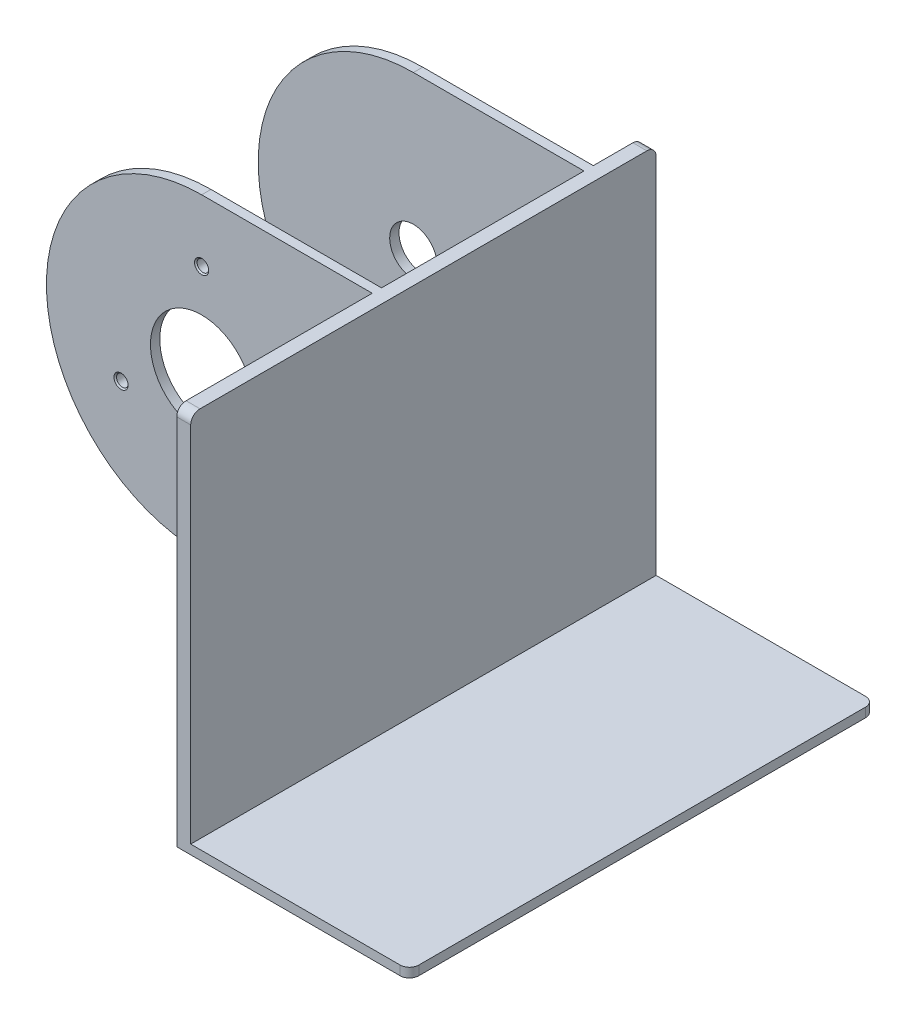
ISO-10303-21;
HEADER;
FILE_DESCRIPTION(('STEP AP214'),'2;1');
FILE_NAME('part.step','',(''),(''),'','','');
FILE_SCHEMA(('AUTOMOTIVE_DESIGN { 1 0 10303 214 1 1 1 1 }'));
ENDSEC;
DATA;
#1=APPLICATION_CONTEXT('core data for automotive mechanical design processes');
#2=APPLICATION_PROTOCOL_DEFINITION('international standard','automotive_design',2000,#1);
#3=PRODUCT_CONTEXT('',#1,'mechanical');
#4=PRODUCT('Part','Part','',(#3));
#5=PRODUCT_RELATED_PRODUCT_CATEGORY('part','',(#4));
#6=PRODUCT_DEFINITION_FORMATION('','',#4);
#7=PRODUCT_DEFINITION_CONTEXT('part definition',#1,'design');
#8=PRODUCT_DEFINITION('design','',#6,#7);
#9=PRODUCT_DEFINITION_SHAPE('','',#8);
#10=(LENGTH_UNIT() NAMED_UNIT(*) SI_UNIT(.MILLI.,.METRE.));
#11=(NAMED_UNIT(*) PLANE_ANGLE_UNIT() SI_UNIT($,.RADIAN.));
#12=(NAMED_UNIT(*) SI_UNIT($,.STERADIAN.) SOLID_ANGLE_UNIT());
#13=UNCERTAINTY_MEASURE_WITH_UNIT(LENGTH_MEASURE(1.E-05),#10,'distance_accuracy_value','');
#14=(GEOMETRIC_REPRESENTATION_CONTEXT(3) GLOBAL_UNCERTAINTY_ASSIGNED_CONTEXT((#13)) GLOBAL_UNIT_ASSIGNED_CONTEXT((#10,
#11,#12)) REPRESENTATION_CONTEXT('',''));
#15=CARTESIAN_POINT('',(0.,0.,0.));
#16=DIRECTION('',(0.,0.,1.));
#17=DIRECTION('',(1.,0.,0.));
#18=AXIS2_PLACEMENT_3D('',#15,#16,#17);
#19=CARTESIAN_POINT('',(0.,82.,0.));
#20=DIRECTION('',(0.,1.,0.));
#21=DIRECTION('',(0.,0.,1.));
#22=AXIS2_PLACEMENT_3D('',#19,#20,#21);
#23=PLANE('',#22);
#24=DIRECTION('',(0.,0.,-1.));
#25=VECTOR('',#24,1.);
#26=CARTESIAN_POINT('',(-22.,82.,-50.));
#27=LINE('',#26,#25);
#28=CARTESIAN_POINT('',(-22.,82.,48.));
#29=VERTEX_POINT('',#28);
#30=CARTESIAN_POINT('',(-22.,82.,-48.));
#31=VERTEX_POINT('',#30);
#32=EDGE_CURVE('E313',#29,#31,#27,.T.);
#33=ORIENTED_EDGE('',*,*,#32,.T.);
#34=DIRECTION('',(-1.,0.,0.));
#35=VECTOR('',#34,1.);
#36=CARTESIAN_POINT('',(-25.,82.,-48.));
#37=LINE('',#36,#35);
#38=CARTESIAN_POINT('',(-25.,82.,-48.));
#39=VERTEX_POINT('',#38);
#40=EDGE_CURVE('E375',#31,#39,#37,.T.);
#41=ORIENTED_EDGE('',*,*,#40,.T.);
#42=DIRECTION('',(0.,0.,1.));
#43=VECTOR('',#42,1.);
#44=CARTESIAN_POINT('',(-25.,82.,-50.));
#45=LINE('',#44,#43);
#46=CARTESIAN_POINT('',(-25.,82.,-39.5));
#47=VERTEX_POINT('',#46);
#48=EDGE_CURVE('E311',#39,#47,#45,.T.);
#49=ORIENTED_EDGE('',*,*,#48,.T.);
#50=DIRECTION('',(1.,0.,0.));
#51=VECTOR('',#50,1.);
#52=CARTESIAN_POINT('',(-95.,82.,-39.5));
#53=LINE('',#52,#51);
#54=CARTESIAN_POINT('',(-61.65,82.,-39.4999999999999));
#55=VERTEX_POINT('',#54);
#56=EDGE_CURVE('E235',#55,#47,#53,.T.);
#57=ORIENTED_EDGE('',*,*,#56,.F.);
#58=DIRECTION('',(0.,0.,-1.));
#59=VECTOR('',#58,1.);
#60=CARTESIAN_POINT('',(-61.65,82.,50.));
#61=LINE('',#60,#59);
#62=CARTESIAN_POINT('',(-61.65,82.,-37.4999999999999));
#63=VERTEX_POINT('',#62);
#64=EDGE_CURVE('E221',#63,#55,#61,.T.);
#65=ORIENTED_EDGE('',*,*,#64,.F.);
#66=DIRECTION('',(1.,0.,0.));
#67=VECTOR('',#66,1.);
#68=CARTESIAN_POINT('',(-95.,82.,-37.5));
#69=LINE('',#68,#67);
#70=CARTESIAN_POINT('',(-25.,82.,-37.5));
#71=VERTEX_POINT('',#70);
#72=EDGE_CURVE('E232',#63,#71,#69,.T.);
#73=ORIENTED_EDGE('',*,*,#72,.T.);
#74=CARTESIAN_POINT('',(-25.,82.,6.));
#75=VERTEX_POINT('',#74);
#76=EDGE_CURVE('E314',#71,#75,#45,.T.);
#77=ORIENTED_EDGE('',*,*,#76,.T.);
#78=DIRECTION('',(1.,0.,0.));
#79=VECTOR('',#78,1.);
#80=CARTESIAN_POINT('',(-95.,82.,6.));
#81=LINE('',#80,#79);
#82=CARTESIAN_POINT('',(-61.65,82.,6.));
#83=VERTEX_POINT('',#82);
#84=EDGE_CURVE('E302',#83,#75,#81,.T.);
#85=ORIENTED_EDGE('',*,*,#84,.F.);
#86=DIRECTION('',(0.,0.,-1.));
#87=VECTOR('',#86,1.);
#88=CARTESIAN_POINT('',(-61.65,82.,8.00000000000001));
#89=LINE('',#88,#87);
#90=CARTESIAN_POINT('',(-61.65,82.,8.));
#91=VERTEX_POINT('',#90);
#92=EDGE_CURVE('E285',#91,#83,#89,.T.);
#93=ORIENTED_EDGE('',*,*,#92,.F.);
#94=DIRECTION('',(1.,0.,0.));
#95=VECTOR('',#94,1.);
#96=CARTESIAN_POINT('',(-95.,82.,8.));
#97=LINE('',#96,#95);
#98=CARTESIAN_POINT('',(-25.,82.,8.));
#99=VERTEX_POINT('',#98);
#100=EDGE_CURVE('E301',#91,#99,#97,.T.);
#101=ORIENTED_EDGE('',*,*,#100,.T.);
#102=CARTESIAN_POINT('',(-25.,82.,48.));
#103=VERTEX_POINT('',#102);
#104=EDGE_CURVE('E315',#99,#103,#45,.T.);
#105=ORIENTED_EDGE('',*,*,#104,.T.);
#106=DIRECTION('',(1.,0.,0.));
#107=VECTOR('',#106,1.);
#108=CARTESIAN_POINT('',(-22.,82.,48.));
#109=LINE('',#108,#107);
#110=EDGE_CURVE('E348',#103,#29,#109,.T.);
#111=ORIENTED_EDGE('',*,*,#110,.T.);
#112=EDGE_LOOP('',(#33,#41,#49,#57,#65,#73,#77,#85,#93,#101,#105,#111));
#113=FACE_BOUND('',#112,.T.);
#114=ADVANCED_FACE('F95',(#113),#23,.T.);
#115=CARTESIAN_POINT('',(-25.,2.,-50.));
#116=DIRECTION('',(0.,0.,1.));
#117=DIRECTION('',(1.,0.,0.));
#118=AXIS2_PLACEMENT_3D('',#115,#116,#117);
#119=PLANE('',#118);
#120=DIRECTION('',(0.,-1.,0.));
#121=VECTOR('',#120,1.);
#122=CARTESIAN_POINT('',(-25.,2.,-50.));
#123=LINE('',#122,#121);
#124=CARTESIAN_POINT('',(-25.,80.,-50.));
#125=VERTEX_POINT('',#124);
#126=CARTESIAN_POINT('',(-25.,0.,-50.));
#127=VERTEX_POINT('',#126);
#128=EDGE_CURVE('E346',#125,#127,#123,.T.);
#129=ORIENTED_EDGE('',*,*,#128,.F.);
#130=DIRECTION('',(-1.,0.,0.));
#131=VECTOR('',#130,1.);
#132=CARTESIAN_POINT('',(-22.,80.,-50.));
#133=LINE('',#132,#131);
#134=CARTESIAN_POINT('',(-22.,80.,-50.));
#135=VERTEX_POINT('',#134);
#136=EDGE_CURVE('E103',#125,#135,#133,.F.);
#137=ORIENTED_EDGE('',*,*,#136,.T.);
#138=DIRECTION('',(0.,-1.,0.));
#139=VECTOR('',#138,1.);
#140=CARTESIAN_POINT('',(-22.,82.,-50.));
#141=LINE('',#140,#139);
#142=CARTESIAN_POINT('',(-22.,2.,-50.));
#143=VERTEX_POINT('',#142);
#144=EDGE_CURVE('E317',#135,#143,#141,.T.);
#145=ORIENTED_EDGE('',*,*,#144,.T.);
#146=DIRECTION('',(-1.,0.,0.));
#147=VECTOR('',#146,1.);
#148=CARTESIAN_POINT('',(-25.,2.,-50.));
#149=LINE('',#148,#147);
#150=CARTESIAN_POINT('',(23.,2.,-50.));
#151=VERTEX_POINT('',#150);
#152=EDGE_CURVE('E327',#151,#143,#149,.T.);
#153=ORIENTED_EDGE('',*,*,#152,.F.);
#154=DIRECTION('',(0.,-1.,0.));
#155=VECTOR('',#154,1.);
#156=CARTESIAN_POINT('',(23.,2.,-50.));
#157=LINE('',#156,#155);
#158=CARTESIAN_POINT('',(23.,0.,-50.));
#159=VERTEX_POINT('',#158);
#160=EDGE_CURVE('E359',#151,#159,#157,.T.);
#161=ORIENTED_EDGE('',*,*,#160,.T.);
#162=DIRECTION('',(-1.,0.,0.));
#163=VECTOR('',#162,1.);
#164=CARTESIAN_POINT('',(-25.,0.,-50.));
#165=LINE('',#164,#163);
#166=EDGE_CURVE('E337',#159,#127,#165,.T.);
#167=ORIENTED_EDGE('',*,*,#166,.T.);
#168=EDGE_LOOP('',(#129,#137,#145,#153,#161,#167));
#169=FACE_BOUND('',#168,.T.);
#170=ADVANCED_FACE('F405',(#169),#119,.F.);
#171=CARTESIAN_POINT('',(-95.,82.,-39.5));
#172=DIRECTION('',(0.,0.,1.));
#173=DIRECTION('',(0.,-1.,0.));
#174=AXIS2_PLACEMENT_3D('',#171,#172,#173);
#175=PLANE('',#174);
#176=CARTESIAN_POINT('',(-61.65,48.65,-39.5));
#177=DIRECTION('',(0.,0.,-1.));
#178=DIRECTION('',(0.,1.,0.));
#179=AXIS2_PLACEMENT_3D('',#176,#177,#178);
#180=CIRCLE('',#179,5.1);
#181=CARTESIAN_POINT('',(-61.65,53.75,-39.5));
#182=VERTEX_POINT('',#181);
#183=EDGE_CURVE('E395',#182,#182,#180,.T.);
#184=ORIENTED_EDGE('',*,*,#183,.F.);
#185=EDGE_LOOP('',(#184));
#186=FACE_BOUND('',#185,.T.);
#187=CARTESIAN_POINT('',(-61.65,48.65,-39.5));
#188=DIRECTION('',(0.,0.,1.));
#189=DIRECTION('',(0.,-1.,0.));
#190=AXIS2_PLACEMENT_3D('',#187,#188,#189);
#191=CIRCLE('',#190,33.35);
#192=CARTESIAN_POINT('',(-61.65,15.3,-39.4999999999999));
#193=VERTEX_POINT('',#192);
#194=EDGE_CURVE('E228',#55,#193,#191,.T.);
#195=ORIENTED_EDGE('',*,*,#194,.F.);
#196=ORIENTED_EDGE('',*,*,#56,.T.);
#197=DIRECTION('',(0.,-1.,0.));
#198=VECTOR('',#197,1.);
#199=CARTESIAN_POINT('',(-25.,82.,-39.5));
#200=LINE('',#199,#198);
#201=CARTESIAN_POINT('',(-25.,15.3,-39.5));
#202=VERTEX_POINT('',#201);
#203=EDGE_CURVE('E386',#47,#202,#200,.T.);
#204=ORIENTED_EDGE('',*,*,#203,.T.);
#205=DIRECTION('',(1.,0.,0.));
#206=VECTOR('',#205,1.);
#207=CARTESIAN_POINT('',(-95.,15.3,-39.5));
#208=LINE('',#207,#206);
#209=EDGE_CURVE('E243',#193,#202,#208,.T.);
#210=ORIENTED_EDGE('',*,*,#209,.F.);
#211=EDGE_LOOP('',(#195,#196,#204,#210));
#212=FACE_BOUND('',#211,.T.);
#213=ADVANCED_FACE('F403',(#186,#212),#175,.F.);
#214=CARTESIAN_POINT('',(-95.,82.,-37.5));
#215=DIRECTION('',(0.,0.,-1.));
#216=DIRECTION('',(0.,1.,0.));
#217=AXIS2_PLACEMENT_3D('',#214,#215,#216);
#218=PLANE('',#217);
#219=CARTESIAN_POINT('',(-61.65,48.65,-37.5));
#220=DIRECTION('',(0.,0.,-1.));
#221=DIRECTION('',(0.,1.,0.));
#222=AXIS2_PLACEMENT_3D('',#219,#220,#221);
#223=CIRCLE('',#222,5.1);
#224=CARTESIAN_POINT('',(-61.65,53.75,-37.5));
#225=VERTEX_POINT('',#224);
#226=EDGE_CURVE('E391',#225,#225,#223,.F.);
#227=ORIENTED_EDGE('',*,*,#226,.F.);
#228=EDGE_LOOP('',(#227));
#229=FACE_BOUND('',#228,.T.);
#230=ORIENTED_EDGE('',*,*,#72,.F.);
#231=CARTESIAN_POINT('',(-61.65,48.65,-37.5));
#232=DIRECTION('',(0.,0.,-1.));
#233=DIRECTION('',(0.,1.,0.));
#234=AXIS2_PLACEMENT_3D('',#231,#232,#233);
#235=CIRCLE('',#234,33.35);
#236=CARTESIAN_POINT('',(-61.65,15.3,-37.5));
#237=VERTEX_POINT('',#236);
#238=EDGE_CURVE('E218',#237,#63,#235,.T.);
#239=ORIENTED_EDGE('',*,*,#238,.F.);
#240=DIRECTION('',(1.,0.,0.));
#241=VECTOR('',#240,1.);
#242=CARTESIAN_POINT('',(-95.,15.3,-37.5));
#243=LINE('',#242,#241);
#244=CARTESIAN_POINT('',(-25.,15.3,-37.5));
#245=VERTEX_POINT('',#244);
#246=EDGE_CURVE('E241',#237,#245,#243,.T.);
#247=ORIENTED_EDGE('',*,*,#246,.T.);
#248=DIRECTION('',(0.,1.,0.));
#249=VECTOR('',#248,1.);
#250=CARTESIAN_POINT('',(-25.,82.,-37.5));
#251=LINE('',#250,#249);
#252=EDGE_CURVE('E239',#245,#71,#251,.T.);
#253=ORIENTED_EDGE('',*,*,#252,.T.);
#254=EDGE_LOOP('',(#230,#239,#247,#253));
#255=FACE_BOUND('',#254,.T.);
#256=ADVANCED_FACE('F237',(#229,#255),#218,.F.);
#257=CARTESIAN_POINT('',(-25.,2.,50.));
#258=DIRECTION('',(1.,0.,0.));
#259=DIRECTION('',(0.,0.,-1.));
#260=AXIS2_PLACEMENT_3D('',#257,#258,#259);
#261=PLANE('',#260);
#262=ORIENTED_EDGE('',*,*,#48,.F.);
#263=CARTESIAN_POINT('',(-25.,80.,-48.));
#264=DIRECTION('',(1.,0.,0.));
#265=DIRECTION('',(0.,0.,-1.));
#266=AXIS2_PLACEMENT_3D('',#263,#264,#265);
#267=CIRCLE('',#266,2.);
#268=EDGE_CURVE('E117',#39,#125,#267,.F.);
#269=ORIENTED_EDGE('',*,*,#268,.T.);
#270=ORIENTED_EDGE('',*,*,#128,.T.);
#271=DIRECTION('',(0.,0.,1.));
#272=VECTOR('',#271,1.);
#273=CARTESIAN_POINT('',(-25.,0.,50.));
#274=LINE('',#273,#272);
#275=CARTESIAN_POINT('',(-25.,0.,50.));
#276=VERTEX_POINT('',#275);
#277=EDGE_CURVE('E340',#127,#276,#274,.T.);
#278=ORIENTED_EDGE('',*,*,#277,.T.);
#279=DIRECTION('',(0.,-1.,0.));
#280=VECTOR('',#279,1.);
#281=CARTESIAN_POINT('',(-25.,2.,50.));
#282=LINE('',#281,#280);
#283=CARTESIAN_POINT('',(-25.,80.,50.));
#284=VERTEX_POINT('',#283);
#285=EDGE_CURVE('E334',#284,#276,#282,.T.);
#286=ORIENTED_EDGE('',*,*,#285,.F.);
#287=CARTESIAN_POINT('',(-25.,80.,48.));
#288=DIRECTION('',(1.,0.,0.));
#289=DIRECTION('',(0.,0.,-1.));
#290=AXIS2_PLACEMENT_3D('',#287,#288,#289);
#291=CIRCLE('',#290,2.);
#292=EDGE_CURVE('E357',#284,#103,#291,.F.);
#293=ORIENTED_EDGE('',*,*,#292,.T.);
#294=ORIENTED_EDGE('',*,*,#104,.F.);
#295=DIRECTION('',(0.,-1.,0.));
#296=VECTOR('',#295,1.);
#297=CARTESIAN_POINT('',(-25.,82.,8.));
#298=LINE('',#297,#296);
#299=CARTESIAN_POINT('',(-25.,15.3,8.00000000000001));
#300=VERTEX_POINT('',#299);
#301=EDGE_CURVE('E292',#99,#300,#298,.T.);
#302=ORIENTED_EDGE('',*,*,#301,.T.);
#303=DIRECTION('',(0.,0.,1.));
#304=VECTOR('',#303,1.);
#305=CARTESIAN_POINT('',(-25.,15.3,6.00000000000001));
#306=LINE('',#305,#304);
#307=CARTESIAN_POINT('',(-25.,15.3,6.00000000000001));
#308=VERTEX_POINT('',#307);
#309=EDGE_CURVE('E295',#308,#300,#306,.T.);
#310=ORIENTED_EDGE('',*,*,#309,.F.);
#311=DIRECTION('',(0.,-1.,0.));
#312=VECTOR('',#311,1.);
#313=CARTESIAN_POINT('',(-25.,82.,6.));
#314=LINE('',#313,#312);
#315=EDGE_CURVE('E298',#75,#308,#314,.T.);
#316=ORIENTED_EDGE('',*,*,#315,.F.);
#317=ORIENTED_EDGE('',*,*,#76,.F.);
#318=ORIENTED_EDGE('',*,*,#252,.F.);
#319=DIRECTION('',(0.,0.,1.));
#320=VECTOR('',#319,1.);
#321=CARTESIAN_POINT('',(-25.,15.3,-39.5));
#322=LINE('',#321,#320);
#323=EDGE_CURVE('E388',#202,#245,#322,.T.);
#324=ORIENTED_EDGE('',*,*,#323,.F.);
#325=ORIENTED_EDGE('',*,*,#203,.F.);
#326=EDGE_LOOP('',(#262,#269,#270,#278,#286,#293,#294,#302,#310,#316,#317,#318,#324,#325));
#327=FACE_BOUND('',#326,.T.);
#328=ADVANCED_FACE('F383',(#327),#261,.F.);
#329=CARTESIAN_POINT('',(-95.,82.,6.));
#330=DIRECTION('',(0.,0.,1.));
#331=DIRECTION('',(0.,-1.,0.));
#332=AXIS2_PLACEMENT_3D('',#329,#330,#331);
#333=PLANE('',#332);
#334=CARTESIAN_POINT('',(-61.65,48.65,6.00000000000001));
#335=DIRECTION('',(0.,0.,1.));
#336=DIRECTION('',(0.,-1.,0.));
#337=AXIS2_PLACEMENT_3D('',#334,#335,#336);
#338=CIRCLE('',#337,11.);
#339=CARTESIAN_POINT('',(-50.65,48.65,6.));
#340=VERTEX_POINT('',#339);
#341=EDGE_CURVE('E250',#340,#340,#338,.F.);
#342=ORIENTED_EDGE('',*,*,#341,.F.);
#343=EDGE_LOOP('',(#342));
#344=FACE_BOUND('',#343,.T.);
#345=CARTESIAN_POINT('',(-61.65,68.65,6.));
#346=DIRECTION('',(0.,0.,1.));
#347=DIRECTION('',(0.,-1.,0.));
#348=AXIS2_PLACEMENT_3D('',#345,#346,#347);
#349=CIRCLE('',#348,1.25);
#350=CARTESIAN_POINT('',(-61.65,67.4,6.));
#351=VERTEX_POINT('',#350);
#352=EDGE_CURVE('E261',#351,#351,#349,.T.);
#353=ORIENTED_EDGE('',*,*,#352,.T.);
#354=EDGE_LOOP('',(#353));
#355=FACE_BOUND('',#354,.T.);
#356=CARTESIAN_POINT('',(-44.3294919243113,38.6499999999999,6.00000000000001));
#357=DIRECTION('',(0.,0.,1.));
#358=DIRECTION('',(0.,-1.,0.));
#359=AXIS2_PLACEMENT_3D('',#356,#357,#358);
#360=CIRCLE('',#359,1.25);
#361=CARTESIAN_POINT('',(-44.3294919243113,37.3999999999999,6.00000000000001));
#362=VERTEX_POINT('',#361);
#363=EDGE_CURVE('E270',#362,#362,#360,.T.);
#364=ORIENTED_EDGE('',*,*,#363,.T.);
#365=EDGE_LOOP('',(#364));
#366=FACE_BOUND('',#365,.T.);
#367=CARTESIAN_POINT('',(-78.9705080756889,38.6500000000002,6.00000000000001));
#368=DIRECTION('',(0.,0.,1.));
#369=DIRECTION('',(0.,-1.,0.));
#370=AXIS2_PLACEMENT_3D('',#367,#368,#369);
#371=CIRCLE('',#370,1.25);
#372=CARTESIAN_POINT('',(-78.9705080756889,37.4000000000002,6.00000000000001));
#373=VERTEX_POINT('',#372);
#374=EDGE_CURVE('E279',#373,#373,#371,.T.);
#375=ORIENTED_EDGE('',*,*,#374,.T.);
#376=EDGE_LOOP('',(#375));
#377=FACE_BOUND('',#376,.T.);
#378=CARTESIAN_POINT('',(-61.65,48.65,6.));
#379=DIRECTION('',(0.,0.,1.));
#380=DIRECTION('',(0.,-1.,0.));
#381=AXIS2_PLACEMENT_3D('',#378,#379,#380);
#382=CIRCLE('',#381,33.35);
#383=CARTESIAN_POINT('',(-61.65,15.3,6.00000000000001));
#384=VERTEX_POINT('',#383);
#385=EDGE_CURVE('E290',#83,#384,#382,.T.);
#386=ORIENTED_EDGE('',*,*,#385,.F.);
#387=ORIENTED_EDGE('',*,*,#84,.T.);
#388=ORIENTED_EDGE('',*,*,#315,.T.);
#389=DIRECTION('',(1.,0.,0.));
#390=VECTOR('',#389,1.);
#391=CARTESIAN_POINT('',(-95.,15.3,6.00000000000001));
#392=LINE('',#391,#390);
#393=EDGE_CURVE('E306',#384,#308,#392,.T.);
#394=ORIENTED_EDGE('',*,*,#393,.F.);
#395=EDGE_LOOP('',(#386,#387,#388,#394));
#396=FACE_BOUND('',#395,.T.);
#397=ADVANCED_FACE('F438',(#344,#355,#366,#377,#396),#333,.F.);
#398=CARTESIAN_POINT('',(0.,2.,0.));
#399=DIRECTION('',(0.,-1.,0.));
#400=DIRECTION('',(0.,0.,-1.));
#401=AXIS2_PLACEMENT_3D('',#398,#399,#400);
#402=PLANE('',#401);
#403=DIRECTION('',(0.,0.,-1.));
#404=VECTOR('',#403,1.);
#405=CARTESIAN_POINT('',(25.,2.,50.));
#406=LINE('',#405,#404);
#407=CARTESIAN_POINT('',(25.,2.,48.));
#408=VERTEX_POINT('',#407);
#409=CARTESIAN_POINT('',(25.,2.,-48.));
#410=VERTEX_POINT('',#409);
#411=EDGE_CURVE('E324',#408,#410,#406,.T.);
#412=ORIENTED_EDGE('',*,*,#411,.T.);
#413=CARTESIAN_POINT('',(23.,2.,-48.));
#414=DIRECTION('',(0.,-1.,0.));
#415=DIRECTION('',(0.,0.,-1.));
#416=AXIS2_PLACEMENT_3D('',#413,#414,#415);
#417=CIRCLE('',#416,2.);
#418=EDGE_CURVE('E373',#410,#151,#417,.F.);
#419=ORIENTED_EDGE('',*,*,#418,.T.);
#420=ORIENTED_EDGE('',*,*,#152,.T.);
#421=DIRECTION('',(0.,0.,-1.));
#422=VECTOR('',#421,1.);
#423=CARTESIAN_POINT('',(-22.,2.,-50.));
#424=LINE('',#423,#422);
#425=CARTESIAN_POINT('',(-22.,2.,50.));
#426=VERTEX_POINT('',#425);
#427=EDGE_CURVE('E305',#426,#143,#424,.T.);
#428=ORIENTED_EDGE('',*,*,#427,.F.);
#429=DIRECTION('',(1.,0.,0.));
#430=VECTOR('',#429,1.);
#431=CARTESIAN_POINT('',(-25.,2.,50.));
#432=LINE('',#431,#430);
#433=CARTESIAN_POINT('',(23.,2.,50.));
#434=VERTEX_POINT('',#433);
#435=EDGE_CURVE('E331',#426,#434,#432,.T.);
#436=ORIENTED_EDGE('',*,*,#435,.T.);
#437=CARTESIAN_POINT('',(23.,2.,48.));
#438=DIRECTION('',(0.,-1.,0.));
#439=DIRECTION('',(0.,0.,-1.));
#440=AXIS2_PLACEMENT_3D('',#437,#438,#439);
#441=CIRCLE('',#440,2.);
#442=EDGE_CURVE('E371',#434,#408,#441,.F.);
#443=ORIENTED_EDGE('',*,*,#442,.T.);
#444=EDGE_LOOP('',(#412,#419,#420,#428,#436,#443));
#445=FACE_BOUND('',#444,.T.);
#446=ADVANCED_FACE('F434',(#445),#402,.F.);
#447=CARTESIAN_POINT('',(25.,2.,50.));
#448=DIRECTION('',(-1.,0.,0.));
#449=DIRECTION('',(0.,0.,1.));
#450=AXIS2_PLACEMENT_3D('',#447,#448,#449);
#451=PLANE('',#450);
#452=DIRECTION('',(0.,0.,-1.));
#453=VECTOR('',#452,1.);
#454=CARTESIAN_POINT('',(25.,0.,50.));
#455=LINE('',#454,#453);
#456=CARTESIAN_POINT('',(25.,0.,48.));
#457=VERTEX_POINT('',#456);
#458=CARTESIAN_POINT('',(25.,0.,-48.));
#459=VERTEX_POINT('',#458);
#460=EDGE_CURVE('E323',#457,#459,#455,.T.);
#461=ORIENTED_EDGE('',*,*,#460,.T.);
#462=DIRECTION('',(0.,-1.,0.));
#463=VECTOR('',#462,1.);
#464=CARTESIAN_POINT('',(25.,2.,-48.));
#465=LINE('',#464,#463);
#466=EDGE_CURVE('E369',#459,#410,#465,.F.);
#467=ORIENTED_EDGE('',*,*,#466,.T.);
#468=ORIENTED_EDGE('',*,*,#411,.F.);
#469=DIRECTION('',(0.,-1.,0.));
#470=VECTOR('',#469,1.);
#471=CARTESIAN_POINT('',(25.,2.,48.));
#472=LINE('',#471,#470);
#473=EDGE_CURVE('E366',#408,#457,#472,.T.);
#474=ORIENTED_EDGE('',*,*,#473,.T.);
#475=EDGE_LOOP('',(#461,#467,#468,#474));
#476=FACE_BOUND('',#475,.T.);
#477=ADVANCED_FACE('F437',(#476),#451,.F.);
#478=CARTESIAN_POINT('',(-25.,2.,50.));
#479=DIRECTION('',(0.,0.,-1.));
#480=DIRECTION('',(-1.,0.,0.));
#481=AXIS2_PLACEMENT_3D('',#478,#479,#480);
#482=PLANE('',#481);
#483=DIRECTION('',(0.,-1.,0.));
#484=VECTOR('',#483,1.);
#485=CARTESIAN_POINT('',(-22.,82.,50.));
#486=LINE('',#485,#484);
#487=CARTESIAN_POINT('',(-22.,80.,50.));
#488=VERTEX_POINT('',#487);
#489=EDGE_CURVE('E321',#488,#426,#486,.T.);
#490=ORIENTED_EDGE('',*,*,#489,.F.);
#491=DIRECTION('',(1.,0.,0.));
#492=VECTOR('',#491,1.);
#493=CARTESIAN_POINT('',(-25.,80.,50.));
#494=LINE('',#493,#492);
#495=EDGE_CURVE('E355',#488,#284,#494,.F.);
#496=ORIENTED_EDGE('',*,*,#495,.T.);
#497=ORIENTED_EDGE('',*,*,#285,.T.);
#498=DIRECTION('',(1.,0.,0.));
#499=VECTOR('',#498,1.);
#500=CARTESIAN_POINT('',(-25.,0.,50.));
#501=LINE('',#500,#499);
#502=CARTESIAN_POINT('',(23.,0.,50.));
#503=VERTEX_POINT('',#502);
#504=EDGE_CURVE('E328',#276,#503,#501,.T.);
#505=ORIENTED_EDGE('',*,*,#504,.T.);
#506=DIRECTION('',(0.,-1.,0.));
#507=VECTOR('',#506,1.);
#508=CARTESIAN_POINT('',(23.,2.,50.));
#509=LINE('',#508,#507);
#510=EDGE_CURVE('E353',#503,#434,#509,.F.);
#511=ORIENTED_EDGE('',*,*,#510,.T.);
#512=ORIENTED_EDGE('',*,*,#435,.F.);
#513=EDGE_LOOP('',(#490,#496,#497,#505,#511,#512));
#514=FACE_BOUND('',#513,.T.);
#515=ADVANCED_FACE('F442',(#514),#482,.F.);
#516=CARTESIAN_POINT('',(0.,0.,0.));
#517=DIRECTION('',(0.,-1.,0.));
#518=DIRECTION('',(0.,0.,-1.));
#519=AXIS2_PLACEMENT_3D('',#516,#517,#518);
#520=PLANE('',#519);
#521=ORIENTED_EDGE('',*,*,#166,.F.);
#522=CARTESIAN_POINT('',(23.,0.,-48.));
#523=DIRECTION('',(0.,-1.,0.));
#524=DIRECTION('',(0.,0.,-1.));
#525=AXIS2_PLACEMENT_3D('',#522,#523,#524);
#526=CIRCLE('',#525,2.);
#527=EDGE_CURVE('E364',#159,#459,#526,.T.);
#528=ORIENTED_EDGE('',*,*,#527,.T.);
#529=ORIENTED_EDGE('',*,*,#460,.F.);
#530=CARTESIAN_POINT('',(23.,0.,48.));
#531=DIRECTION('',(0.,-1.,0.));
#532=DIRECTION('',(0.,0.,-1.));
#533=AXIS2_PLACEMENT_3D('',#530,#531,#532);
#534=CIRCLE('',#533,2.);
#535=EDGE_CURVE('E362',#457,#503,#534,.T.);
#536=ORIENTED_EDGE('',*,*,#535,.T.);
#537=ORIENTED_EDGE('',*,*,#504,.F.);
#538=ORIENTED_EDGE('',*,*,#277,.F.);
#539=EDGE_LOOP('',(#521,#528,#529,#536,#537,#538));
#540=FACE_BOUND('',#539,.T.);
#541=ADVANCED_FACE('F432',(#540),#520,.T.);
#542=CARTESIAN_POINT('',(-22.,82.,-50.));
#543=DIRECTION('',(-1.,0.,0.));
#544=DIRECTION('',(0.,0.,1.));
#545=AXIS2_PLACEMENT_3D('',#542,#543,#544);
#546=PLANE('',#545);
#547=ORIENTED_EDGE('',*,*,#144,.F.);
#548=CARTESIAN_POINT('',(-22.,80.,-48.));
#549=DIRECTION('',(-1.,0.,0.));
#550=DIRECTION('',(0.,0.,1.));
#551=AXIS2_PLACEMENT_3D('',#548,#549,#550);
#552=CIRCLE('',#551,2.);
#553=EDGE_CURVE('E12',#135,#31,#552,.F.);
#554=ORIENTED_EDGE('',*,*,#553,.T.);
#555=ORIENTED_EDGE('',*,*,#32,.F.);
#556=CARTESIAN_POINT('',(-22.,80.,48.));
#557=DIRECTION('',(-1.,0.,0.));
#558=DIRECTION('',(0.,0.,1.));
#559=AXIS2_PLACEMENT_3D('',#556,#557,#558);
#560=CIRCLE('',#559,2.);
#561=EDGE_CURVE('E351',#29,#488,#560,.F.);
#562=ORIENTED_EDGE('',*,*,#561,.T.);
#563=ORIENTED_EDGE('',*,*,#489,.T.);
#564=ORIENTED_EDGE('',*,*,#427,.T.);
#565=EDGE_LOOP('',(#547,#554,#555,#562,#563,#564));
#566=FACE_BOUND('',#565,.T.);
#567=ADVANCED_FACE('F428',(#566),#546,.F.);
#568=CARTESIAN_POINT('',(-95.,15.3,6.00000000000001));
#569=DIRECTION('',(0.,1.,0.));
#570=DIRECTION('',(0.,0.,1.));
#571=AXIS2_PLACEMENT_3D('',#568,#569,#570);
#572=PLANE('',#571);
#573=DIRECTION('',(1.,0.,0.));
#574=VECTOR('',#573,1.);
#575=CARTESIAN_POINT('',(-95.,15.3,8.00000000000001));
#576=LINE('',#575,#574);
#577=CARTESIAN_POINT('',(-61.65,15.3,8.00000000000001));
#578=VERTEX_POINT('',#577);
#579=EDGE_CURVE('E308',#578,#300,#576,.T.);
#580=ORIENTED_EDGE('',*,*,#579,.F.);
#581=DIRECTION('',(0.,0.,-1.));
#582=VECTOR('',#581,1.);
#583=CARTESIAN_POINT('',(-61.65,15.3,8.00000000000001));
#584=LINE('',#583,#582);
#585=EDGE_CURVE('E282',#578,#384,#584,.T.);
#586=ORIENTED_EDGE('',*,*,#585,.T.);
#587=ORIENTED_EDGE('',*,*,#393,.T.);
#588=ORIENTED_EDGE('',*,*,#309,.T.);
#589=EDGE_LOOP('',(#580,#586,#587,#588));
#590=FACE_BOUND('',#589,.T.);
#591=ADVANCED_FACE('F431',(#590),#572,.F.);
#592=CARTESIAN_POINT('',(-95.,82.,8.));
#593=DIRECTION('',(0.,0.,1.));
#594=DIRECTION('',(0.,-1.,0.));
#595=AXIS2_PLACEMENT_3D('',#592,#593,#594);
#596=PLANE('',#595);
#597=CARTESIAN_POINT('',(-61.65,48.65,8.00000000000001));
#598=DIRECTION('',(0.,0.,1.));
#599=DIRECTION('',(1.,0.,0.));
#600=AXIS2_PLACEMENT_3D('',#597,#598,#599);
#601=CIRCLE('',#600,11.);
#602=CARTESIAN_POINT('',(-50.65,48.65,8.00000000000001));
#603=VERTEX_POINT('',#602);
#604=EDGE_CURVE('E249',#603,#603,#601,.T.);
#605=ORIENTED_EDGE('',*,*,#604,.F.);
#606=EDGE_LOOP('',(#605));
#607=FACE_BOUND('',#606,.T.);
#608=CARTESIAN_POINT('',(-61.65,68.65,8.00000000000001));
#609=DIRECTION('',(0.,0.,1.));
#610=DIRECTION('',(1.,0.,0.));
#611=AXIS2_PLACEMENT_3D('',#608,#609,#610);
#612=CIRCLE('',#611,1.525);
#613=CARTESIAN_POINT('',(-60.125,68.65,8.00000000000001));
#614=VERTEX_POINT('',#613);
#615=EDGE_CURVE('E253',#614,#614,#612,.T.);
#616=ORIENTED_EDGE('',*,*,#615,.F.);
#617=EDGE_LOOP('',(#616));
#618=FACE_BOUND('',#617,.T.);
#619=CARTESIAN_POINT('',(-44.3294919243113,38.6499999999999,8.00000000000001));
#620=DIRECTION('',(0.,0.,1.));
#621=DIRECTION('',(1.,0.,0.));
#622=AXIS2_PLACEMENT_3D('',#619,#620,#621);
#623=CIRCLE('',#622,1.525);
#624=CARTESIAN_POINT('',(-42.8044919243113,38.6499999999999,8.00000000000001));
#625=VERTEX_POINT('',#624);
#626=EDGE_CURVE('E264',#625,#625,#623,.T.);
#627=ORIENTED_EDGE('',*,*,#626,.F.);
#628=EDGE_LOOP('',(#627));
#629=FACE_BOUND('',#628,.T.);
#630=CARTESIAN_POINT('',(-78.9705080756889,38.6500000000002,8.00000000000001));
#631=DIRECTION('',(0.,0.,1.));
#632=DIRECTION('',(1.,0.,0.));
#633=AXIS2_PLACEMENT_3D('',#630,#631,#632);
#634=CIRCLE('',#633,1.525);
#635=CARTESIAN_POINT('',(-77.4455080756889,38.6500000000002,8.00000000000001));
#636=VERTEX_POINT('',#635);
#637=EDGE_CURVE('E273',#636,#636,#634,.T.);
#638=ORIENTED_EDGE('',*,*,#637,.F.);
#639=EDGE_LOOP('',(#638));
#640=FACE_BOUND('',#639,.T.);
#641=CARTESIAN_POINT('',(-61.65,48.65,8.00000000000001));
#642=DIRECTION('',(0.,0.,-1.));
#643=DIRECTION('',(1.,0.,0.));
#644=AXIS2_PLACEMENT_3D('',#641,#642,#643);
#645=CIRCLE('',#644,33.35);
#646=EDGE_CURVE('E283',#578,#91,#645,.T.);
#647=ORIENTED_EDGE('',*,*,#646,.F.);
#648=ORIENTED_EDGE('',*,*,#579,.T.);
#649=ORIENTED_EDGE('',*,*,#301,.F.);
#650=ORIENTED_EDGE('',*,*,#100,.F.);
#651=EDGE_LOOP('',(#647,#648,#649,#650));
#652=FACE_BOUND('',#651,.T.);
#653=ADVANCED_FACE('F426',(#607,#618,#629,#640,#652),#596,.T.);
#654=CARTESIAN_POINT('',(-61.65,48.65,8.00000000000001));
#655=DIRECTION('',(0.,0.,-1.));
#656=DIRECTION('',(-1.,0.,0.));
#657=AXIS2_PLACEMENT_3D('',#654,#655,#656);
#658=CYLINDRICAL_SURFACE('',#657,33.35);
#659=ORIENTED_EDGE('',*,*,#646,.T.);
#660=ORIENTED_EDGE('',*,*,#92,.T.);
#661=ORIENTED_EDGE('',*,*,#385,.T.);
#662=ORIENTED_EDGE('',*,*,#585,.F.);
#663=EDGE_LOOP('',(#659,#660,#661,#662));
#664=FACE_BOUND('',#663,.T.);
#665=ADVANCED_FACE('F498',(#664),#658,.T.);
#666=CARTESIAN_POINT('',(-78.9705080756889,38.6500000000002,8.00000000000001));
#667=DIRECTION('',(0.,0.,1.));
#668=DIRECTION('',(1.,0.,0.));
#669=AXIS2_PLACEMENT_3D('',#666,#667,#668);
#670=CYLINDRICAL_SURFACE('',#669,1.25);
#671=ORIENTED_EDGE('',*,*,#374,.F.);
#672=EDGE_LOOP('',(#671));
#673=FACE_BOUND('',#672,.T.);
#674=CARTESIAN_POINT('',(-78.9705080756889,38.6500000000002,7.72500000000001));
#675=DIRECTION('',(0.,0.,1.));
#676=DIRECTION('',(1.,0.,0.));
#677=AXIS2_PLACEMENT_3D('',#674,#675,#676);
#678=CIRCLE('',#677,1.25);
#679=CARTESIAN_POINT('',(-77.7205080756889,38.6500000000002,7.72500000000001));
#680=VERTEX_POINT('',#679);
#681=EDGE_CURVE('E276',#680,#680,#678,.T.);
#682=ORIENTED_EDGE('',*,*,#681,.T.);
#683=EDGE_LOOP('',(#682));
#684=FACE_BOUND('',#683,.T.);
#685=ADVANCED_FACE('F502',(#673,#684),#670,.F.);
#686=CARTESIAN_POINT('',(-78.9705080756889,38.6500000000002,8.00000000000001));
#687=DIRECTION('',(0.,0.,1.));
#688=DIRECTION('',(1.,0.,0.));
#689=AXIS2_PLACEMENT_3D('',#686,#687,#688);
#690=CONICAL_SURFACE('',#689,1.525,0.785398163397445);
#691=ORIENTED_EDGE('',*,*,#681,.F.);
#692=EDGE_LOOP('',(#691));
#693=FACE_BOUND('',#692,.T.);
#694=ORIENTED_EDGE('',*,*,#637,.T.);
#695=EDGE_LOOP('',(#694));
#696=FACE_BOUND('',#695,.T.);
#697=ADVANCED_FACE('F603',(#693,#696),#690,.F.);
#698=CARTESIAN_POINT('',(-44.3294919243113,38.6499999999999,8.00000000000001));
#699=DIRECTION('',(0.,0.,1.));
#700=DIRECTION('',(1.,0.,0.));
#701=AXIS2_PLACEMENT_3D('',#698,#699,#700);
#702=CYLINDRICAL_SURFACE('',#701,1.25);
#703=ORIENTED_EDGE('',*,*,#363,.F.);
#704=EDGE_LOOP('',(#703));
#705=FACE_BOUND('',#704,.T.);
#706=CARTESIAN_POINT('',(-44.3294919243113,38.6499999999999,7.72500000000001));
#707=DIRECTION('',(0.,0.,1.));
#708=DIRECTION('',(1.,0.,0.));
#709=AXIS2_PLACEMENT_3D('',#706,#707,#708);
#710=CIRCLE('',#709,1.25);
#711=CARTESIAN_POINT('',(-43.0794919243113,38.6499999999999,7.72500000000001));
#712=VERTEX_POINT('',#711);
#713=EDGE_CURVE('E267',#712,#712,#710,.T.);
#714=ORIENTED_EDGE('',*,*,#713,.T.);
#715=EDGE_LOOP('',(#714));
#716=FACE_BOUND('',#715,.T.);
#717=ADVANCED_FACE('F614',(#705,#716),#702,.F.);
#718=CARTESIAN_POINT('',(-44.3294919243113,38.6499999999999,8.00000000000001));
#719=DIRECTION('',(0.,0.,1.));
#720=DIRECTION('',(1.,0.,0.));
#721=AXIS2_PLACEMENT_3D('',#718,#719,#720);
#722=CONICAL_SURFACE('',#721,1.525,0.785398163397445);
#723=ORIENTED_EDGE('',*,*,#713,.F.);
#724=EDGE_LOOP('',(#723));
#725=FACE_BOUND('',#724,.T.);
#726=ORIENTED_EDGE('',*,*,#626,.T.);
#727=EDGE_LOOP('',(#726));
#728=FACE_BOUND('',#727,.T.);
#729=ADVANCED_FACE('F623',(#725,#728),#722,.F.);
#730=CARTESIAN_POINT('',(-61.65,68.65,8.00000000000001));
#731=DIRECTION('',(0.,0.,1.));
#732=DIRECTION('',(1.,0.,0.));
#733=AXIS2_PLACEMENT_3D('',#730,#731,#732);
#734=CYLINDRICAL_SURFACE('',#733,1.25);
#735=ORIENTED_EDGE('',*,*,#352,.F.);
#736=EDGE_LOOP('',(#735));
#737=FACE_BOUND('',#736,.T.);
#738=CARTESIAN_POINT('',(-61.65,68.65,7.72500000000001));
#739=DIRECTION('',(0.,0.,1.));
#740=DIRECTION('',(1.,0.,0.));
#741=AXIS2_PLACEMENT_3D('',#738,#739,#740);
#742=CIRCLE('',#741,1.25);
#743=CARTESIAN_POINT('',(-60.4,68.65,7.72500000000001));
#744=VERTEX_POINT('',#743);
#745=EDGE_CURVE('E258',#744,#744,#742,.T.);
#746=ORIENTED_EDGE('',*,*,#745,.T.);
#747=EDGE_LOOP('',(#746));
#748=FACE_BOUND('',#747,.T.);
#749=ADVANCED_FACE('F634',(#737,#748),#734,.F.);
#750=CARTESIAN_POINT('',(-61.65,68.65,8.00000000000001));
#751=DIRECTION('',(0.,0.,1.));
#752=DIRECTION('',(1.,0.,0.));
#753=AXIS2_PLACEMENT_3D('',#750,#751,#752);
#754=CONICAL_SURFACE('',#753,1.525,0.785398163397445);
#755=ORIENTED_EDGE('',*,*,#745,.F.);
#756=EDGE_LOOP('',(#755));
#757=FACE_BOUND('',#756,.T.);
#758=ORIENTED_EDGE('',*,*,#615,.T.);
#759=EDGE_LOOP('',(#758));
#760=FACE_BOUND('',#759,.T.);
#761=ADVANCED_FACE('F456',(#757,#760),#754,.F.);
#762=CARTESIAN_POINT('',(0.,80.,48.));
#763=DIRECTION('',(-1.,0.,0.));
#764=DIRECTION('',(0.,0.,1.));
#765=AXIS2_PLACEMENT_3D('',#762,#763,#764);
#766=CYLINDRICAL_SURFACE('',#765,2.);
#767=ORIENTED_EDGE('',*,*,#292,.F.);
#768=ORIENTED_EDGE('',*,*,#495,.F.);
#769=ORIENTED_EDGE('',*,*,#561,.F.);
#770=ORIENTED_EDGE('',*,*,#110,.F.);
#771=EDGE_LOOP('',(#767,#768,#769,#770));
#772=FACE_BOUND('',#771,.T.);
#773=ADVANCED_FACE('F452',(#772),#766,.T.);
#774=CARTESIAN_POINT('',(23.,2.,-48.));
#775=DIRECTION('',(0.,-1.,0.));
#776=DIRECTION('',(0.,0.,-1.));
#777=AXIS2_PLACEMENT_3D('',#774,#775,#776);
#778=CYLINDRICAL_SURFACE('',#777,2.);
#779=ORIENTED_EDGE('',*,*,#418,.F.);
#780=ORIENTED_EDGE('',*,*,#466,.F.);
#781=ORIENTED_EDGE('',*,*,#527,.F.);
#782=ORIENTED_EDGE('',*,*,#160,.F.);
#783=EDGE_LOOP('',(#779,#780,#781,#782));
#784=FACE_BOUND('',#783,.T.);
#785=ADVANCED_FACE('F455',(#784),#778,.T.);
#786=CARTESIAN_POINT('',(23.,2.,48.));
#787=DIRECTION('',(0.,-1.,0.));
#788=DIRECTION('',(0.,0.,-1.));
#789=AXIS2_PLACEMENT_3D('',#786,#787,#788);
#790=CYLINDRICAL_SURFACE('',#789,2.);
#791=ORIENTED_EDGE('',*,*,#442,.F.);
#792=ORIENTED_EDGE('',*,*,#510,.F.);
#793=ORIENTED_EDGE('',*,*,#535,.F.);
#794=ORIENTED_EDGE('',*,*,#473,.F.);
#795=EDGE_LOOP('',(#791,#792,#793,#794));
#796=FACE_BOUND('',#795,.T.);
#797=ADVANCED_FACE('F459',(#796),#790,.T.);
#798=CARTESIAN_POINT('',(-61.65,48.65,-50.001));
#799=DIRECTION('',(0.,0.,1.));
#800=DIRECTION('',(1.,0.,0.));
#801=AXIS2_PLACEMENT_3D('',#798,#799,#800);
#802=CYLINDRICAL_SURFACE('',#801,11.);
#803=CARTESIAN_POINT('',(-50.65,48.65,8.00000000000001));
#804=CARTESIAN_POINT('',(-50.65,48.65,7.97916666666668));
#805=CARTESIAN_POINT('',(-50.65,48.65,7.95833333333335));
#806=CARTESIAN_POINT('',(-50.65,48.65,7.91666666666668));
#807=CARTESIAN_POINT('',(-50.65,48.65,7.89583333333335));
#808=CARTESIAN_POINT('',(-50.65,48.65,7.85416666666668));
#809=CARTESIAN_POINT('',(-50.65,48.65,7.83333333333335));
#810=CARTESIAN_POINT('',(-50.65,48.65,7.79166666666668));
#811=CARTESIAN_POINT('',(-50.65,48.65,7.77083333333335));
#812=CARTESIAN_POINT('',(-50.65,48.65,7.72916666666668));
#813=CARTESIAN_POINT('',(-50.65,48.65,7.70833333333335));
#814=CARTESIAN_POINT('',(-50.65,48.65,7.66666666666668));
#815=CARTESIAN_POINT('',(-50.65,48.65,7.64583333333335));
#816=CARTESIAN_POINT('',(-50.65,48.65,7.60416666666668));
#817=CARTESIAN_POINT('',(-50.65,48.65,7.58333333333335));
#818=CARTESIAN_POINT('',(-50.65,48.65,7.54166666666668));
#819=CARTESIAN_POINT('',(-50.65,48.65,7.52083333333335));
#820=CARTESIAN_POINT('',(-50.65,48.65,7.47916666666668));
#821=CARTESIAN_POINT('',(-50.65,48.65,7.45833333333334));
#822=CARTESIAN_POINT('',(-50.65,48.65,7.41666666666667));
#823=CARTESIAN_POINT('',(-50.65,48.65,7.39583333333334));
#824=CARTESIAN_POINT('',(-50.65,48.65,7.35416666666667));
#825=CARTESIAN_POINT('',(-50.65,48.65,7.33333333333334));
#826=CARTESIAN_POINT('',(-50.65,48.65,7.29166666666667));
#827=CARTESIAN_POINT('',(-50.65,48.65,7.27083333333334));
#828=CARTESIAN_POINT('',(-50.65,48.65,7.22916666666667));
#829=CARTESIAN_POINT('',(-50.65,48.65,7.20833333333334));
#830=CARTESIAN_POINT('',(-50.65,48.65,7.16666666666667));
#831=CARTESIAN_POINT('',(-50.65,48.65,7.14583333333334));
#832=CARTESIAN_POINT('',(-50.65,48.65,7.10416666666667));
#833=CARTESIAN_POINT('',(-50.65,48.65,7.08333333333334));
#834=CARTESIAN_POINT('',(-50.65,48.65,7.04166666666667));
#835=CARTESIAN_POINT('',(-50.65,48.65,7.02083333333334));
#836=CARTESIAN_POINT('',(-50.65,48.65,6.97916666666667));
#837=CARTESIAN_POINT('',(-50.65,48.65,6.95833333333334));
#838=CARTESIAN_POINT('',(-50.65,48.65,6.91666666666667));
#839=CARTESIAN_POINT('',(-50.65,48.65,6.89583333333334));
#840=CARTESIAN_POINT('',(-50.65,48.65,6.85416666666667));
#841=CARTESIAN_POINT('',(-50.65,48.65,6.83333333333334));
#842=CARTESIAN_POINT('',(-50.65,48.65,6.79166666666667));
#843=CARTESIAN_POINT('',(-50.65,48.65,6.77083333333334));
#844=CARTESIAN_POINT('',(-50.65,48.65,6.72916666666667));
#845=CARTESIAN_POINT('',(-50.65,48.65,6.70833333333334));
#846=CARTESIAN_POINT('',(-50.65,48.65,6.66666666666667));
#847=CARTESIAN_POINT('',(-50.65,48.65,6.64583333333334));
#848=CARTESIAN_POINT('',(-50.65,48.65,6.60416666666667));
#849=CARTESIAN_POINT('',(-50.65,48.65,6.58333333333334));
#850=CARTESIAN_POINT('',(-50.65,48.65,6.54166666666667));
#851=CARTESIAN_POINT('',(-50.65,48.65,6.52083333333333));
#852=CARTESIAN_POINT('',(-50.65,48.65,6.47916666666667));
#853=CARTESIAN_POINT('',(-50.65,48.65,6.45833333333333));
#854=CARTESIAN_POINT('',(-50.65,48.65,6.41666666666667));
#855=CARTESIAN_POINT('',(-50.65,48.65,6.39583333333333));
#856=CARTESIAN_POINT('',(-50.65,48.65,6.35416666666667));
#857=CARTESIAN_POINT('',(-50.65,48.65,6.33333333333333));
#858=CARTESIAN_POINT('',(-50.65,48.65,6.29166666666667));
#859=CARTESIAN_POINT('',(-50.65,48.65,6.27083333333333));
#860=CARTESIAN_POINT('',(-50.65,48.65,6.22916666666667));
#861=CARTESIAN_POINT('',(-50.65,48.65,6.20833333333333));
#862=CARTESIAN_POINT('',(-50.65,48.65,6.16666666666667));
#863=CARTESIAN_POINT('',(-50.65,48.65,6.14583333333333));
#864=CARTESIAN_POINT('',(-50.65,48.65,6.10416666666667));
#865=CARTESIAN_POINT('',(-50.65,48.65,6.08333333333333));
#866=CARTESIAN_POINT('',(-50.65,48.65,6.04166666666667));
#867=CARTESIAN_POINT('',(-50.65,48.65,6.02083333333333));
#868=CARTESIAN_POINT('',(-50.65,48.65,6.));
#869=B_SPLINE_CURVE_WITH_KNOTS('',3,(#803,#804,#805,#806,#807,#808,#809,#810,#811,#812,#813,
#814,#815,#816,#817,#818,#819,#820,#821,#822,#823,#824,#825,#826,#827,#828,#829,#830,#831,#832,
#833,#834,#835,#836,#837,#838,#839,#840,#841,#842,#843,#844,#845,#846,#847,#848,#849,#850,#851,
#852,#853,#854,#855,#856,#857,#858,#859,#860,#861,#862,#863,#864,#865,#866,#867,#868),
.UNSPECIFIED.,.F.,.F.,(4,2,2,2,2,2,2,2,2,2,2,2,2,2,2,2,2,2,2,2,2,2,2,2,2,2,2,2,2,2,2,2,4),(0.,
0.0625000000000001,0.125,0.1875,0.25,0.3125,0.375,0.4375,0.5,0.562500000000007,
0.625000000000008,0.687500000000008,0.750000000000008,0.812500000000008,0.875000000000008,
0.937500000000008,1.00000000000001,1.06250000000001,1.12500000000001,1.18750000000001,
1.25000000000001,1.31250000000001,1.37500000000001,1.43750000000001,1.50000000000002,
1.56250000000002,1.62500000000002,1.68750000000002,1.75000000000002,1.81250000000002,
1.87500000000002,1.93750000000002,2.00000000000002),.UNSPECIFIED.);
#870=EDGE_CURVE('BSEAM462',#603,#340,#869,.T.);
#871=ORIENTED_EDGE('',*,*,#604,.T.);
#872=ORIENTED_EDGE('',*,*,#341,.T.);
#873=ORIENTED_EDGE('',*,*,#870,.T.);
#874=ORIENTED_EDGE('',*,*,#870,.F.);
#875=EDGE_LOOP('',(#871,#873,#872,#874));
#876=FACE_BOUND('',#875,.T.);
#877=ADVANCED_FACE('F462',(#876),#802,.F.);
#878=CARTESIAN_POINT('',(-95.,15.3,-39.5));
#879=DIRECTION('',(0.,1.,0.));
#880=DIRECTION('',(0.,0.,1.));
#881=AXIS2_PLACEMENT_3D('',#878,#879,#880);
#882=PLANE('',#881);
#883=ORIENTED_EDGE('',*,*,#246,.F.);
#884=DIRECTION('',(0.,0.,-1.));
#885=VECTOR('',#884,1.);
#886=CARTESIAN_POINT('',(-61.65,15.3,50.));
#887=LINE('',#886,#885);
#888=EDGE_CURVE('E224',#237,#193,#887,.T.);
#889=ORIENTED_EDGE('',*,*,#888,.T.);
#890=ORIENTED_EDGE('',*,*,#209,.T.);
#891=ORIENTED_EDGE('',*,*,#323,.T.);
#892=EDGE_LOOP('',(#883,#889,#890,#891));
#893=FACE_BOUND('',#892,.T.);
#894=ADVANCED_FACE('F402',(#893),#882,.F.);
#895=CARTESIAN_POINT('',(-61.65,48.65,50.001));
#896=DIRECTION('',(0.,0.,-1.));
#897=DIRECTION('',(0.,1.,0.));
#898=AXIS2_PLACEMENT_3D('',#895,#896,#897);
#899=CYLINDRICAL_SURFACE('',#898,5.1);
#900=ORIENTED_EDGE('',*,*,#183,.T.);
#901=EDGE_LOOP('',(#900));
#902=FACE_BOUND('',#901,.T.);
#903=ORIENTED_EDGE('',*,*,#226,.T.);
#904=EDGE_LOOP('',(#903));
#905=FACE_BOUND('',#904,.T.);
#906=ADVANCED_FACE('F483',(#902,#905),#899,.F.);
#907=CARTESIAN_POINT('',(-61.65,48.65,50.));
#908=DIRECTION('',(0.,0.,-1.));
#909=DIRECTION('',(0.,1.,0.));
#910=AXIS2_PLACEMENT_3D('',#907,#908,#909);
#911=CYLINDRICAL_SURFACE('',#910,33.35);
#912=ORIENTED_EDGE('',*,*,#194,.T.);
#913=ORIENTED_EDGE('',*,*,#888,.F.);
#914=ORIENTED_EDGE('',*,*,#238,.T.);
#915=ORIENTED_EDGE('',*,*,#64,.T.);
#916=EDGE_LOOP('',(#912,#913,#914,#915));
#917=FACE_BOUND('',#916,.T.);
#918=ADVANCED_FACE('F220',(#917),#911,.T.);
#919=CARTESIAN_POINT('',(0.,80.,-48.));
#920=DIRECTION('',(1.,0.,0.));
#921=DIRECTION('',(0.,0.,-1.));
#922=AXIS2_PLACEMENT_3D('',#919,#920,#921);
#923=CYLINDRICAL_SURFACE('',#922,2.);
#924=ORIENTED_EDGE('',*,*,#553,.F.);
#925=ORIENTED_EDGE('',*,*,#136,.F.);
#926=ORIENTED_EDGE('',*,*,#268,.F.);
#927=ORIENTED_EDGE('',*,*,#40,.F.);
#928=EDGE_LOOP('',(#924,#925,#926,#927));
#929=FACE_BOUND('',#928,.T.);
#930=ADVANCED_FACE('F97',(#929),#923,.T.);
#931=CLOSED_SHELL('',(#114,#170,#213,#256,#328,#397,#446,#477,#515,#541,#567,#591,#653,#665,
#685,#697,#717,#729,#749,#761,#773,#785,#797,#877,#894,#906,#918,#930));
#932=MANIFOLD_SOLID_BREP('B2',#931);
#933=ADVANCED_BREP_SHAPE_REPRESENTATION('',(#18,#932),#14);
#934=SHAPE_DEFINITION_REPRESENTATION(#9,#933);
ENDSEC;
END-ISO-10303-21;
